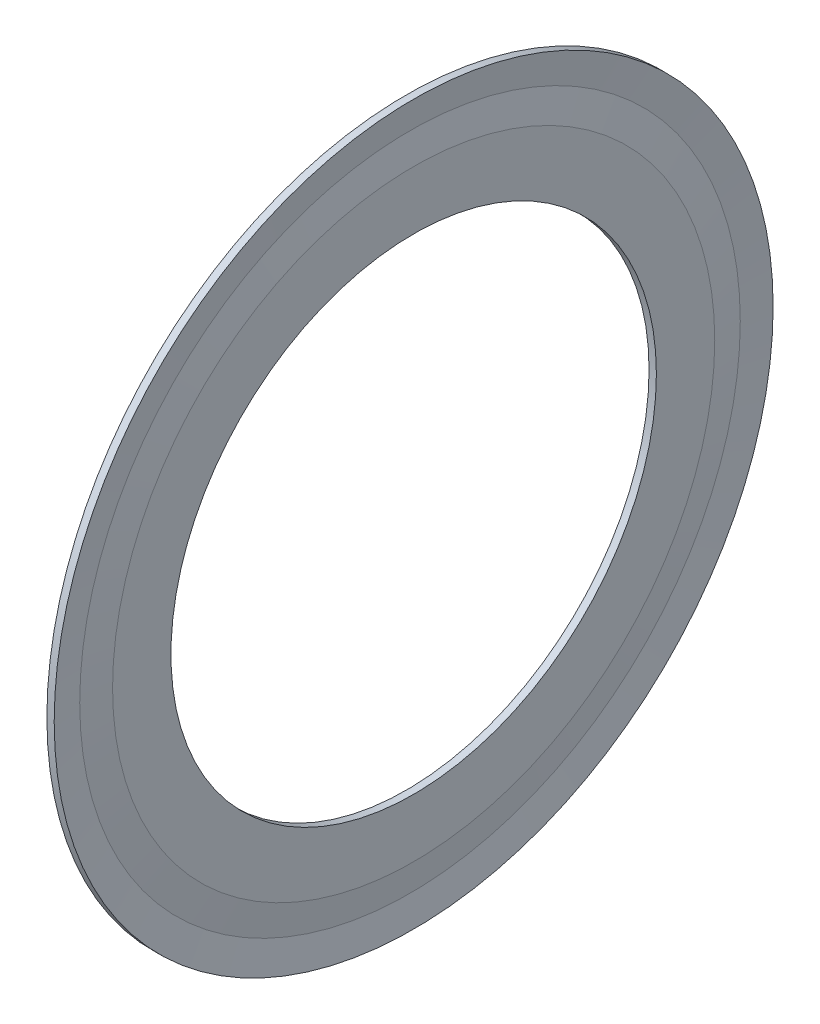
ISO-10303-21;
HEADER;
FILE_DESCRIPTION(('STEP AP214'),'2;1');
FILE_NAME('part.step','',(''),(''),'','','');
FILE_SCHEMA(('AUTOMOTIVE_DESIGN { 1 0 10303 214 1 1 1 1 }'));
ENDSEC;
DATA;
#1=APPLICATION_CONTEXT('core data for automotive mechanical design processes');
#2=APPLICATION_PROTOCOL_DEFINITION('international standard','automotive_design',2000,#1);
#3=PRODUCT_CONTEXT('',#1,'mechanical');
#4=PRODUCT('Part','Part','',(#3));
#5=PRODUCT_RELATED_PRODUCT_CATEGORY('part','',(#4));
#6=PRODUCT_DEFINITION_FORMATION('','',#4);
#7=PRODUCT_DEFINITION_CONTEXT('part definition',#1,'design');
#8=PRODUCT_DEFINITION('design','',#6,#7);
#9=PRODUCT_DEFINITION_SHAPE('','',#8);
#10=(LENGTH_UNIT() NAMED_UNIT(*) SI_UNIT(.MILLI.,.METRE.));
#11=(NAMED_UNIT(*) PLANE_ANGLE_UNIT() SI_UNIT($,.RADIAN.));
#12=(NAMED_UNIT(*) SI_UNIT($,.STERADIAN.) SOLID_ANGLE_UNIT());
#13=UNCERTAINTY_MEASURE_WITH_UNIT(LENGTH_MEASURE(1.E-05),#10,'distance_accuracy_value','');
#14=(GEOMETRIC_REPRESENTATION_CONTEXT(3) GLOBAL_UNCERTAINTY_ASSIGNED_CONTEXT((#13)) GLOBAL_UNIT_ASSIGNED_CONTEXT((#10,
#11,#12)) REPRESENTATION_CONTEXT('',''));
#15=CARTESIAN_POINT('',(0.,0.,0.));
#16=DIRECTION('',(0.,0.,1.));
#17=DIRECTION('',(1.,0.,0.));
#18=AXIS2_PLACEMENT_3D('',#15,#16,#17);
#19=CARTESIAN_POINT('',(4.404247,5.3525841223684,0.));
#20=DIRECTION('',(-1.,0.,0.));
#21=DIRECTION('',(0.,0.,1.));
#22=AXIS2_PLACEMENT_3D('',#19,#20,#21);
#23=PLANE('',#22);
#24=CARTESIAN_POINT('',(4.404247,0.,0.));
#25=DIRECTION('',(1.,0.,0.));
#26=DIRECTION('',(0.,0.,-1.));
#27=AXIS2_PLACEMENT_3D('',#24,#25,#26);
#28=CIRCLE('',#27,4.9);
#29=CARTESIAN_POINT('',(4.404247,0.,-4.9));
#30=VERTEX_POINT('',#29);
#31=EDGE_CURVE('E10',#30,#30,#28,.T.);
#32=ORIENTED_EDGE('',*,*,#31,.T.);
#33=EDGE_LOOP('',(#32));
#34=FACE_BOUND('',#33,.T.);
#35=CARTESIAN_POINT('',(4.404247,0.,0.));
#36=DIRECTION('',(1.,0.,0.));
#37=DIRECTION('',(0.,0.,-1.));
#38=AXIS2_PLACEMENT_3D('',#35,#36,#37);
#39=CIRCLE('',#38,5.3525841223684);
#40=CARTESIAN_POINT('',(4.404247,0.,-5.3525841223684));
#41=VERTEX_POINT('',#40);
#42=EDGE_CURVE('E58',#41,#41,#39,.T.);
#43=ORIENTED_EDGE('',*,*,#42,.F.);
#44=EDGE_LOOP('',(#43));
#45=FACE_BOUND('',#44,.T.);
#46=ADVANCED_FACE('F30',(#34,#45),#23,.T.);
#47=CARTESIAN_POINT('',(4.404247,0.,0.));
#48=DIRECTION('',(-1.,0.,0.));
#49=DIRECTION('',(0.,0.,1.));
#50=AXIS2_PLACEMENT_3D('',#47,#48,#49);
#51=CONICAL_SURFACE('',#50,4.9,1.44602677885603);
#52=CARTESIAN_POINT('',(4.523397,0.,0.));
#53=DIRECTION('',(1.,0.,0.));
#54=DIRECTION('',(0.,0.,-1.));
#55=AXIS2_PLACEMENT_3D('',#52,#53,#54);
#56=CIRCLE('',#55,3.95);
#57=CARTESIAN_POINT('',(4.523397,0.,-3.95));
#58=VERTEX_POINT('',#57);
#59=EDGE_CURVE('E36',#58,#58,#56,.T.);
#60=ORIENTED_EDGE('',*,*,#59,.T.);
#61=EDGE_LOOP('',(#60));
#62=FACE_BOUND('',#61,.T.);
#63=ORIENTED_EDGE('',*,*,#31,.F.);
#64=EDGE_LOOP('',(#63));
#65=FACE_BOUND('',#64,.T.);
#66=ADVANCED_FACE('F66',(#62,#65),#51,.F.);
#67=CARTESIAN_POINT('',(50.,0.,0.));
#68=DIRECTION('',(1.,0.,0.));
#69=DIRECTION('',(0.,0.,-1.));
#70=AXIS2_PLACEMENT_3D('',#67,#68,#69);
#71=CYLINDRICAL_SURFACE('',#70,3.95);
#72=CARTESIAN_POINT('',(4.642547,0.,0.));
#73=DIRECTION('',(1.,0.,0.));
#74=DIRECTION('',(0.,0.,-1.));
#75=AXIS2_PLACEMENT_3D('',#72,#73,#74);
#76=CIRCLE('',#75,3.95);
#77=CARTESIAN_POINT('',(4.642547,0.,-3.95));
#78=VERTEX_POINT('',#77);
#79=EDGE_CURVE('E40',#78,#78,#76,.T.);
#80=ORIENTED_EDGE('',*,*,#79,.T.);
#81=EDGE_LOOP('',(#80));
#82=FACE_BOUND('',#81,.T.);
#83=ORIENTED_EDGE('',*,*,#59,.F.);
#84=EDGE_LOOP('',(#83));
#85=FACE_BOUND('',#84,.T.);
#86=ADVANCED_FACE('F70',(#82,#85),#71,.F.);
#87=CARTESIAN_POINT('',(4.642547,3.95,0.));
#88=DIRECTION('',(1.,0.,0.));
#89=DIRECTION('',(0.,0.,-1.));
#90=AXIS2_PLACEMENT_3D('',#87,#88,#89);
#91=PLANE('',#90);
#92=CARTESIAN_POINT('',(4.642547,0.,0.));
#93=DIRECTION('',(1.,0.,0.));
#94=DIRECTION('',(0.,0.,-1.));
#95=AXIS2_PLACEMENT_3D('',#92,#93,#94);
#96=CIRCLE('',#95,4.9);
#97=CARTESIAN_POINT('',(4.642547,0.,-4.9));
#98=VERTEX_POINT('',#97);
#99=EDGE_CURVE('E44',#98,#98,#96,.T.);
#100=ORIENTED_EDGE('',*,*,#99,.T.);
#101=EDGE_LOOP('',(#100));
#102=FACE_BOUND('',#101,.T.);
#103=ORIENTED_EDGE('',*,*,#79,.F.);
#104=EDGE_LOOP('',(#103));
#105=FACE_BOUND('',#104,.T.);
#106=ADVANCED_FACE('F74',(#102,#105),#91,.T.);
#107=CARTESIAN_POINT('',(4.642547,0.,0.));
#108=DIRECTION('',(-1.,0.,0.));
#109=DIRECTION('',(0.,0.,1.));
#110=AXIS2_PLACEMENT_3D('',#107,#108,#109);
#111=CONICAL_SURFACE('',#110,4.9,1.44602677885603);
#112=CARTESIAN_POINT('',(4.582972,0.,0.));
#113=DIRECTION('',(1.,0.,0.));
#114=DIRECTION('',(0.,0.,-1.));
#115=AXIS2_PLACEMENT_3D('',#112,#113,#114);
#116=CIRCLE('',#115,5.375);
#117=CARTESIAN_POINT('',(4.582972,0.,-5.375));
#118=VERTEX_POINT('',#117);
#119=EDGE_CURVE('E49',#118,#118,#116,.T.);
#120=ORIENTED_EDGE('',*,*,#119,.T.);
#121=EDGE_LOOP('',(#120));
#122=FACE_BOUND('',#121,.T.);
#123=ORIENTED_EDGE('',*,*,#99,.F.);
#124=EDGE_LOOP('',(#123));
#125=FACE_BOUND('',#124,.T.);
#126=ADVANCED_FACE('F81',(#122,#125),#111,.T.);
#127=CARTESIAN_POINT('',(4.582972,0.,0.));
#128=DIRECTION('',(1.,0.,0.));
#129=DIRECTION('',(0.,0.,-1.));
#130=AXIS2_PLACEMENT_3D('',#127,#128,#129);
#131=CONICAL_SURFACE('',#130,5.375,1.44602677885603);
#132=CARTESIAN_POINT('',(4.642547,0.,0.));
#133=DIRECTION('',(1.,0.,0.));
#134=DIRECTION('',(0.,0.,-1.));
#135=AXIS2_PLACEMENT_3D('',#132,#133,#134);
#136=CIRCLE('',#135,5.85);
#137=CARTESIAN_POINT('',(4.642547,0.,-5.85));
#138=VERTEX_POINT('',#137);
#139=EDGE_CURVE('E52',#138,#138,#136,.T.);
#140=ORIENTED_EDGE('',*,*,#139,.T.);
#141=EDGE_LOOP('',(#140));
#142=FACE_BOUND('',#141,.T.);
#143=ORIENTED_EDGE('',*,*,#119,.F.);
#144=EDGE_LOOP('',(#143));
#145=FACE_BOUND('',#144,.T.);
#146=ADVANCED_FACE('F85',(#142,#145),#131,.F.);
#147=CARTESIAN_POINT('',(50.,0.,0.));
#148=DIRECTION('',(1.,0.,0.));
#149=DIRECTION('',(0.,0.,-1.));
#150=AXIS2_PLACEMENT_3D('',#147,#148,#149);
#151=CYLINDRICAL_SURFACE('',#150,5.85);
#152=CARTESIAN_POINT('',(4.523397,0.,0.));
#153=DIRECTION('',(1.,0.,0.));
#154=DIRECTION('',(0.,0.,-1.));
#155=AXIS2_PLACEMENT_3D('',#152,#153,#154);
#156=CIRCLE('',#155,5.85);
#157=CARTESIAN_POINT('',(4.523397,0.,-5.85));
#158=VERTEX_POINT('',#157);
#159=EDGE_CURVE('E55',#158,#158,#156,.T.);
#160=ORIENTED_EDGE('',*,*,#159,.T.);
#161=EDGE_LOOP('',(#160));
#162=FACE_BOUND('',#161,.T.);
#163=ORIENTED_EDGE('',*,*,#139,.F.);
#164=EDGE_LOOP('',(#163));
#165=FACE_BOUND('',#164,.T.);
#166=ADVANCED_FACE('F89',(#162,#165),#151,.T.);
#167=CARTESIAN_POINT('',(4.523397,0.,0.));
#168=DIRECTION('',(1.,0.,0.));
#169=DIRECTION('',(0.,0.,-1.));
#170=AXIS2_PLACEMENT_3D('',#167,#168,#169);
#171=CONICAL_SURFACE('',#170,5.85,1.33568823852216);
#172=ORIENTED_EDGE('',*,*,#42,.T.);
#173=EDGE_LOOP('',(#172));
#174=FACE_BOUND('',#173,.T.);
#175=ORIENTED_EDGE('',*,*,#159,.F.);
#176=EDGE_LOOP('',(#175));
#177=FACE_BOUND('',#176,.T.);
#178=ADVANCED_FACE('F62',(#174,#177),#171,.T.);
#179=CLOSED_SHELL('',(#46,#66,#86,#106,#126,#146,#166,#178));
#180=MANIFOLD_SOLID_BREP('B2',#179);
#181=ADVANCED_BREP_SHAPE_REPRESENTATION('',(#18,#180),#14);
#182=SHAPE_DEFINITION_REPRESENTATION(#9,#181);
ENDSEC;
END-ISO-10303-21;
